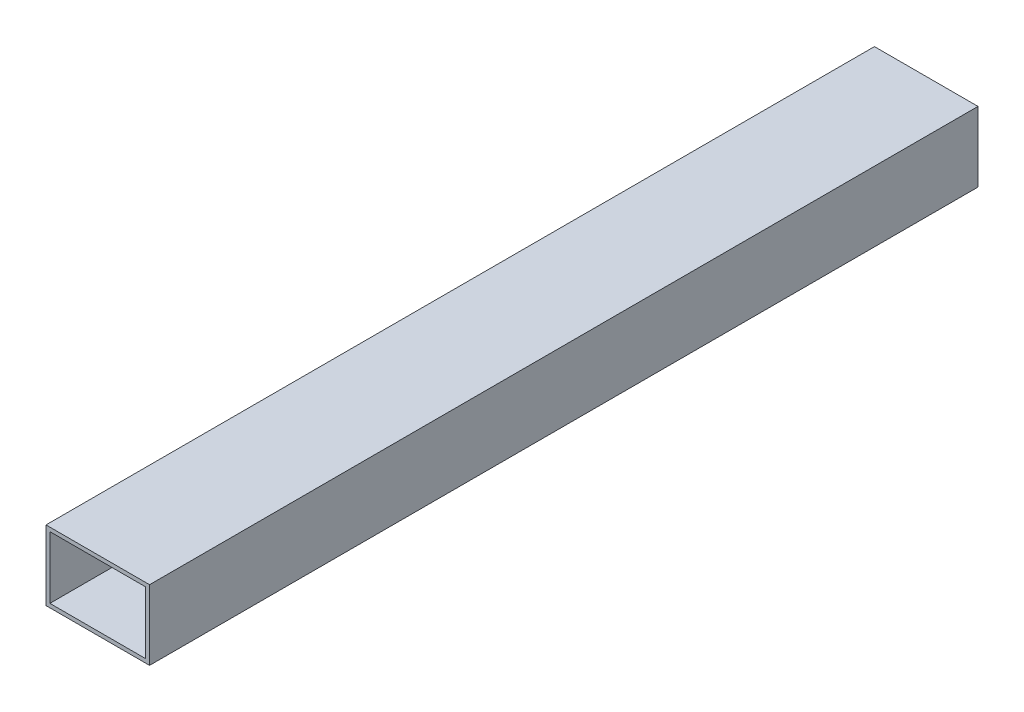
ISO-10303-21;
HEADER;
FILE_DESCRIPTION(('STEP AP214'),'2;1');
FILE_NAME('part.step','',(''),(''),'','','');
FILE_SCHEMA(('AUTOMOTIVE_DESIGN { 1 0 10303 214 1 1 1 1 }'));
ENDSEC;
DATA;
#1=APPLICATION_CONTEXT('core data for automotive mechanical design processes');
#2=APPLICATION_PROTOCOL_DEFINITION('international standard','automotive_design',2000,#1);
#3=PRODUCT_CONTEXT('',#1,'mechanical');
#4=PRODUCT('Part','Part','',(#3));
#5=PRODUCT_RELATED_PRODUCT_CATEGORY('part','',(#4));
#6=PRODUCT_DEFINITION_FORMATION('','',#4);
#7=PRODUCT_DEFINITION_CONTEXT('part definition',#1,'design');
#8=PRODUCT_DEFINITION('design','',#6,#7);
#9=PRODUCT_DEFINITION_SHAPE('','',#8);
#10=(LENGTH_UNIT() NAMED_UNIT(*) SI_UNIT(.MILLI.,.METRE.));
#11=(NAMED_UNIT(*) PLANE_ANGLE_UNIT() SI_UNIT($,.RADIAN.));
#12=(NAMED_UNIT(*) SI_UNIT($,.STERADIAN.) SOLID_ANGLE_UNIT());
#13=UNCERTAINTY_MEASURE_WITH_UNIT(LENGTH_MEASURE(1.E-05),#10,'distance_accuracy_value','');
#14=(GEOMETRIC_REPRESENTATION_CONTEXT(3) GLOBAL_UNCERTAINTY_ASSIGNED_CONTEXT((#13)) GLOBAL_UNIT_ASSIGNED_CONTEXT((#10,
#11,#12)) REPRESENTATION_CONTEXT('',''));
#15=CARTESIAN_POINT('',(0.,0.,0.));
#16=DIRECTION('',(0.,0.,1.));
#17=DIRECTION('',(1.,0.,0.));
#18=AXIS2_PLACEMENT_3D('',#15,#16,#17);
#19=CARTESIAN_POINT('',(0.,0.,320.));
#20=DIRECTION('',(0.,0.,-1.));
#21=DIRECTION('',(-1.,0.,0.));
#22=AXIS2_PLACEMENT_3D('',#19,#20,#21);
#23=PLANE('',#22);
#24=DIRECTION('',(0.,-1.,0.));
#25=VECTOR('',#24,1.);
#26=CARTESIAN_POINT('',(0.,0.,320.));
#27=LINE('',#26,#25);
#28=CARTESIAN_POINT('',(0.,27.,320.));
#29=VERTEX_POINT('',#28);
#30=CARTESIAN_POINT('',(0.,0.,320.));
#31=VERTEX_POINT('',#30);
#32=EDGE_CURVE('E134',#29,#31,#27,.T.);
#33=ORIENTED_EDGE('',*,*,#32,.T.);
#34=DIRECTION('',(1.,0.,0.));
#35=VECTOR('',#34,1.);
#36=CARTESIAN_POINT('',(0.,0.,320.));
#37=LINE('',#36,#35);
#38=CARTESIAN_POINT('',(40.,0.,320.));
#39=VERTEX_POINT('',#38);
#40=EDGE_CURVE('E137',#31,#39,#37,.T.);
#41=ORIENTED_EDGE('',*,*,#40,.T.);
#42=DIRECTION('',(0.,1.,0.));
#43=VECTOR('',#42,1.);
#44=CARTESIAN_POINT('',(40.,0.,320.));
#45=LINE('',#44,#43);
#46=CARTESIAN_POINT('',(40.,27.,320.));
#47=VERTEX_POINT('',#46);
#48=EDGE_CURVE('E140',#39,#47,#45,.T.);
#49=ORIENTED_EDGE('',*,*,#48,.T.);
#50=DIRECTION('',(-1.,0.,0.));
#51=VECTOR('',#50,1.);
#52=CARTESIAN_POINT('',(0.,27.,320.));
#53=LINE('',#52,#51);
#54=EDGE_CURVE('E142',#47,#29,#53,.T.);
#55=ORIENTED_EDGE('',*,*,#54,.T.);
#56=EDGE_LOOP('',(#33,#41,#49,#55));
#57=FACE_BOUND('',#56,.T.);
#58=DIRECTION('',(0.,-1.,0.));
#59=VECTOR('',#58,1.);
#60=CARTESIAN_POINT('',(1.5,25.5,320.));
#61=LINE('',#60,#59);
#62=CARTESIAN_POINT('',(1.5,25.5,320.));
#63=VERTEX_POINT('',#62);
#64=CARTESIAN_POINT('',(1.5,1.5,320.));
#65=VERTEX_POINT('',#64);
#66=EDGE_CURVE('E98',#63,#65,#61,.T.);
#67=ORIENTED_EDGE('',*,*,#66,.F.);
#68=DIRECTION('',(-1.,0.,0.));
#69=VECTOR('',#68,1.);
#70=CARTESIAN_POINT('',(1.5,25.5,320.));
#71=LINE('',#70,#69);
#72=CARTESIAN_POINT('',(38.5,25.5,320.));
#73=VERTEX_POINT('',#72);
#74=EDGE_CURVE('E120',#73,#63,#71,.T.);
#75=ORIENTED_EDGE('',*,*,#74,.F.);
#76=DIRECTION('',(0.,1.,0.));
#77=VECTOR('',#76,1.);
#78=CARTESIAN_POINT('',(38.5,25.5,320.));
#79=LINE('',#78,#77);
#80=CARTESIAN_POINT('',(38.5,1.5,320.));
#81=VERTEX_POINT('',#80);
#82=EDGE_CURVE('E118',#81,#73,#79,.T.);
#83=ORIENTED_EDGE('',*,*,#82,.F.);
#84=DIRECTION('',(1.,0.,0.));
#85=VECTOR('',#84,1.);
#86=CARTESIAN_POINT('',(1.5,1.5,320.));
#87=LINE('',#86,#85);
#88=EDGE_CURVE('E106',#65,#81,#87,.T.);
#89=ORIENTED_EDGE('',*,*,#88,.F.);
#90=EDGE_LOOP('',(#67,#75,#83,#89));
#91=FACE_BOUND('',#90,.T.);
#92=ADVANCED_FACE('F33',(#57,#91),#23,.F.);
#93=CARTESIAN_POINT('',(0.,0.,0.));
#94=DIRECTION('',(0.,0.,-1.));
#95=DIRECTION('',(-1.,0.,0.));
#96=AXIS2_PLACEMENT_3D('',#93,#94,#95);
#97=PLANE('',#96);
#98=DIRECTION('',(0.,-1.,0.));
#99=VECTOR('',#98,1.);
#100=CARTESIAN_POINT('',(0.,0.,0.));
#101=LINE('',#100,#99);
#102=CARTESIAN_POINT('',(0.,27.,0.));
#103=VERTEX_POINT('',#102);
#104=CARTESIAN_POINT('',(0.,0.,0.));
#105=VERTEX_POINT('',#104);
#106=EDGE_CURVE('E114',#103,#105,#101,.T.);
#107=ORIENTED_EDGE('',*,*,#106,.F.);
#108=DIRECTION('',(-1.,0.,0.));
#109=VECTOR('',#108,1.);
#110=CARTESIAN_POINT('',(0.,27.,0.));
#111=LINE('',#110,#109);
#112=CARTESIAN_POINT('',(40.,27.,0.));
#113=VERTEX_POINT('',#112);
#114=EDGE_CURVE('E138',#113,#103,#111,.T.);
#115=ORIENTED_EDGE('',*,*,#114,.F.);
#116=DIRECTION('',(0.,1.,0.));
#117=VECTOR('',#116,1.);
#118=CARTESIAN_POINT('',(40.,0.,0.));
#119=LINE('',#118,#117);
#120=CARTESIAN_POINT('',(40.,0.,0.));
#121=VERTEX_POINT('',#120);
#122=EDGE_CURVE('E149',#121,#113,#119,.T.);
#123=ORIENTED_EDGE('',*,*,#122,.F.);
#124=DIRECTION('',(1.,0.,0.));
#125=VECTOR('',#124,1.);
#126=CARTESIAN_POINT('',(0.,0.,0.));
#127=LINE('',#126,#125);
#128=EDGE_CURVE('E147',#105,#121,#127,.T.);
#129=ORIENTED_EDGE('',*,*,#128,.F.);
#130=EDGE_LOOP('',(#107,#115,#123,#129));
#131=FACE_BOUND('',#130,.T.);
#132=DIRECTION('',(-1.,0.,0.));
#133=VECTOR('',#132,1.);
#134=CARTESIAN_POINT('',(1.5,25.5,0.));
#135=LINE('',#134,#133);
#136=CARTESIAN_POINT('',(38.5,25.5,0.));
#137=VERTEX_POINT('',#136);
#138=CARTESIAN_POINT('',(1.5,25.5,0.));
#139=VERTEX_POINT('',#138);
#140=EDGE_CURVE('E107',#137,#139,#135,.T.);
#141=ORIENTED_EDGE('',*,*,#140,.T.);
#142=DIRECTION('',(0.,-1.,0.));
#143=VECTOR('',#142,1.);
#144=CARTESIAN_POINT('',(1.5,25.5,0.));
#145=LINE('',#144,#143);
#146=CARTESIAN_POINT('',(1.5,1.5,0.));
#147=VERTEX_POINT('',#146);
#148=EDGE_CURVE('E56',#139,#147,#145,.T.);
#149=ORIENTED_EDGE('',*,*,#148,.T.);
#150=DIRECTION('',(1.,0.,0.));
#151=VECTOR('',#150,1.);
#152=CARTESIAN_POINT('',(1.5,1.5,0.));
#153=LINE('',#152,#151);
#154=CARTESIAN_POINT('',(38.5,1.5,0.));
#155=VERTEX_POINT('',#154);
#156=EDGE_CURVE('E113',#147,#155,#153,.T.);
#157=ORIENTED_EDGE('',*,*,#156,.T.);
#158=DIRECTION('',(0.,1.,0.));
#159=VECTOR('',#158,1.);
#160=CARTESIAN_POINT('',(38.5,25.5,0.));
#161=LINE('',#160,#159);
#162=EDGE_CURVE('E126',#155,#137,#161,.T.);
#163=ORIENTED_EDGE('',*,*,#162,.T.);
#164=EDGE_LOOP('',(#141,#149,#157,#163));
#165=FACE_BOUND('',#164,.T.);
#166=ADVANCED_FACE('F167',(#131,#165),#97,.T.);
#167=CARTESIAN_POINT('',(0.,0.,320.));
#168=DIRECTION('',(1.,0.,0.));
#169=DIRECTION('',(0.,1.,0.));
#170=AXIS2_PLACEMENT_3D('',#167,#168,#169);
#171=PLANE('',#170);
#172=ORIENTED_EDGE('',*,*,#106,.T.);
#173=DIRECTION('',(0.,0.,-1.));
#174=VECTOR('',#173,1.);
#175=CARTESIAN_POINT('',(0.,0.,320.));
#176=LINE('',#175,#174);
#177=EDGE_CURVE('E11',#31,#105,#176,.T.);
#178=ORIENTED_EDGE('',*,*,#177,.F.);
#179=ORIENTED_EDGE('',*,*,#32,.F.);
#180=DIRECTION('',(0.,0.,-1.));
#181=VECTOR('',#180,1.);
#182=CARTESIAN_POINT('',(0.,27.,320.));
#183=LINE('',#182,#181);
#184=EDGE_CURVE('E144',#29,#103,#183,.T.);
#185=ORIENTED_EDGE('',*,*,#184,.T.);
#186=EDGE_LOOP('',(#172,#178,#179,#185));
#187=FACE_BOUND('',#186,.T.);
#188=ADVANCED_FACE('F35',(#187),#171,.F.);
#189=CARTESIAN_POINT('',(0.,0.,320.));
#190=DIRECTION('',(0.,1.,0.));
#191=DIRECTION('',(0.,0.,1.));
#192=AXIS2_PLACEMENT_3D('',#189,#190,#191);
#193=PLANE('',#192);
#194=ORIENTED_EDGE('',*,*,#128,.T.);
#195=DIRECTION('',(0.,0.,-1.));
#196=VECTOR('',#195,1.);
#197=CARTESIAN_POINT('',(40.,0.,320.));
#198=LINE('',#197,#196);
#199=EDGE_CURVE('E41',#39,#121,#198,.T.);
#200=ORIENTED_EDGE('',*,*,#199,.F.);
#201=ORIENTED_EDGE('',*,*,#40,.F.);
#202=ORIENTED_EDGE('',*,*,#177,.T.);
#203=EDGE_LOOP('',(#194,#200,#201,#202));
#204=FACE_BOUND('',#203,.T.);
#205=ADVANCED_FACE('F177',(#204),#193,.F.);
#206=CARTESIAN_POINT('',(40.,0.,320.));
#207=DIRECTION('',(-1.,0.,0.));
#208=DIRECTION('',(0.,-1.,0.));
#209=AXIS2_PLACEMENT_3D('',#206,#207,#208);
#210=PLANE('',#209);
#211=ORIENTED_EDGE('',*,*,#122,.T.);
#212=DIRECTION('',(0.,0.,-1.));
#213=VECTOR('',#212,1.);
#214=CARTESIAN_POINT('',(40.,27.,320.));
#215=LINE('',#214,#213);
#216=EDGE_CURVE('E154',#47,#113,#215,.T.);
#217=ORIENTED_EDGE('',*,*,#216,.F.);
#218=ORIENTED_EDGE('',*,*,#48,.F.);
#219=ORIENTED_EDGE('',*,*,#199,.T.);
#220=EDGE_LOOP('',(#211,#217,#218,#219));
#221=FACE_BOUND('',#220,.T.);
#222=ADVANCED_FACE('F161',(#221),#210,.F.);
#223=CARTESIAN_POINT('',(0.,27.,320.));
#224=DIRECTION('',(0.,-1.,0.));
#225=DIRECTION('',(0.,0.,-1.));
#226=AXIS2_PLACEMENT_3D('',#223,#224,#225);
#227=PLANE('',#226);
#228=ORIENTED_EDGE('',*,*,#114,.T.);
#229=ORIENTED_EDGE('',*,*,#184,.F.);
#230=ORIENTED_EDGE('',*,*,#54,.F.);
#231=ORIENTED_EDGE('',*,*,#216,.T.);
#232=EDGE_LOOP('',(#228,#229,#230,#231));
#233=FACE_BOUND('',#232,.T.);
#234=ADVANCED_FACE('F171',(#233),#227,.F.);
#235=CARTESIAN_POINT('',(1.5,25.5,320.));
#236=DIRECTION('',(1.,0.,0.));
#237=DIRECTION('',(0.,1.,0.));
#238=AXIS2_PLACEMENT_3D('',#235,#236,#237);
#239=PLANE('',#238);
#240=ORIENTED_EDGE('',*,*,#148,.F.);
#241=DIRECTION('',(0.,0.,-1.));
#242=VECTOR('',#241,1.);
#243=CARTESIAN_POINT('',(1.5,25.5,320.));
#244=LINE('',#243,#242);
#245=EDGE_CURVE('E102',#63,#139,#244,.T.);
#246=ORIENTED_EDGE('',*,*,#245,.F.);
#247=ORIENTED_EDGE('',*,*,#66,.T.);
#248=DIRECTION('',(0.,0.,-1.));
#249=VECTOR('',#248,1.);
#250=CARTESIAN_POINT('',(1.5,1.5,320.));
#251=LINE('',#250,#249);
#252=EDGE_CURVE('E101',#65,#147,#251,.T.);
#253=ORIENTED_EDGE('',*,*,#252,.T.);
#254=EDGE_LOOP('',(#240,#246,#247,#253));
#255=FACE_BOUND('',#254,.T.);
#256=ADVANCED_FACE('F100',(#255),#239,.T.);
#257=CARTESIAN_POINT('',(1.5,1.5,320.));
#258=DIRECTION('',(0.,1.,0.));
#259=DIRECTION('',(0.,0.,1.));
#260=AXIS2_PLACEMENT_3D('',#257,#258,#259);
#261=PLANE('',#260);
#262=ORIENTED_EDGE('',*,*,#156,.F.);
#263=ORIENTED_EDGE('',*,*,#252,.F.);
#264=ORIENTED_EDGE('',*,*,#88,.T.);
#265=DIRECTION('',(0.,0.,-1.));
#266=VECTOR('',#265,1.);
#267=CARTESIAN_POINT('',(38.5,1.5,320.));
#268=LINE('',#267,#266);
#269=EDGE_CURVE('E115',#81,#155,#268,.T.);
#270=ORIENTED_EDGE('',*,*,#269,.T.);
#271=EDGE_LOOP('',(#262,#263,#264,#270));
#272=FACE_BOUND('',#271,.T.);
#273=ADVANCED_FACE('F110',(#272),#261,.T.);
#274=CARTESIAN_POINT('',(38.5,25.5,320.));
#275=DIRECTION('',(-1.,0.,0.));
#276=DIRECTION('',(0.,-1.,0.));
#277=AXIS2_PLACEMENT_3D('',#274,#275,#276);
#278=PLANE('',#277);
#279=ORIENTED_EDGE('',*,*,#162,.F.);
#280=ORIENTED_EDGE('',*,*,#269,.F.);
#281=ORIENTED_EDGE('',*,*,#82,.T.);
#282=DIRECTION('',(0.,0.,-1.));
#283=VECTOR('',#282,1.);
#284=CARTESIAN_POINT('',(38.5,25.5,320.));
#285=LINE('',#284,#283);
#286=EDGE_CURVE('E48',#73,#137,#285,.T.);
#287=ORIENTED_EDGE('',*,*,#286,.T.);
#288=EDGE_LOOP('',(#279,#280,#281,#287));
#289=FACE_BOUND('',#288,.T.);
#290=ADVANCED_FACE('F200',(#289),#278,.T.);
#291=CARTESIAN_POINT('',(1.5,25.5,320.));
#292=DIRECTION('',(0.,-1.,0.));
#293=DIRECTION('',(0.,0.,-1.));
#294=AXIS2_PLACEMENT_3D('',#291,#292,#293);
#295=PLANE('',#294);
#296=ORIENTED_EDGE('',*,*,#140,.F.);
#297=ORIENTED_EDGE('',*,*,#286,.F.);
#298=ORIENTED_EDGE('',*,*,#74,.T.);
#299=ORIENTED_EDGE('',*,*,#245,.T.);
#300=EDGE_LOOP('',(#296,#297,#298,#299));
#301=FACE_BOUND('',#300,.T.);
#302=ADVANCED_FACE('F204',(#301),#295,.T.);
#303=CLOSED_SHELL('',(#92,#166,#188,#205,#222,#234,#256,#273,#290,#302));
#304=MANIFOLD_SOLID_BREP('B2',#303);
#305=ADVANCED_BREP_SHAPE_REPRESENTATION('',(#18,#304),#14);
#306=SHAPE_DEFINITION_REPRESENTATION(#9,#305);
ENDSEC;
END-ISO-10303-21;
